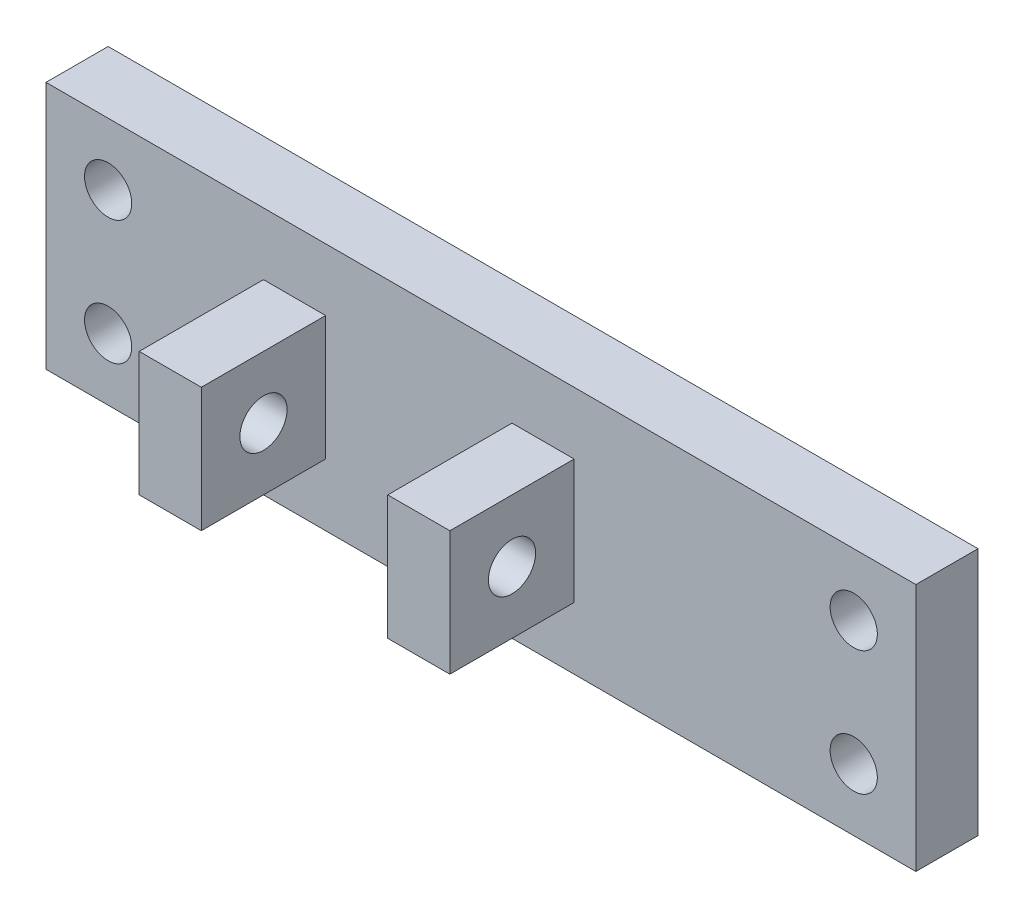
ISO-10303-21;
HEADER;
FILE_DESCRIPTION(('STEP AP214'),'2;1');
FILE_NAME('part.step','',(''),(''),'','','');
FILE_SCHEMA(('AUTOMOTIVE_DESIGN { 1 0 10303 214 1 1 1 1 }'));
ENDSEC;
DATA;
#1=APPLICATION_CONTEXT('core data for automotive mechanical design processes');
#2=APPLICATION_PROTOCOL_DEFINITION('international standard','automotive_design',2000,#1);
#3=PRODUCT_CONTEXT('',#1,'mechanical');
#4=PRODUCT('Part','Part','',(#3));
#5=PRODUCT_RELATED_PRODUCT_CATEGORY('part','',(#4));
#6=PRODUCT_DEFINITION_FORMATION('','',#4);
#7=PRODUCT_DEFINITION_CONTEXT('part definition',#1,'design');
#8=PRODUCT_DEFINITION('design','',#6,#7);
#9=PRODUCT_DEFINITION_SHAPE('','',#8);
#10=(LENGTH_UNIT() NAMED_UNIT(*) SI_UNIT(.MILLI.,.METRE.));
#11=(NAMED_UNIT(*) PLANE_ANGLE_UNIT() SI_UNIT($,.RADIAN.));
#12=(NAMED_UNIT(*) SI_UNIT($,.STERADIAN.) SOLID_ANGLE_UNIT());
#13=UNCERTAINTY_MEASURE_WITH_UNIT(LENGTH_MEASURE(1.E-05),#10,'distance_accuracy_value','');
#14=(GEOMETRIC_REPRESENTATION_CONTEXT(3) GLOBAL_UNCERTAINTY_ASSIGNED_CONTEXT((#13)) GLOBAL_UNIT_ASSIGNED_CONTEXT((#10,
#11,#12)) REPRESENTATION_CONTEXT('',''));
#15=CARTESIAN_POINT('',(0.,0.,0.));
#16=DIRECTION('',(0.,0.,1.));
#17=DIRECTION('',(1.,0.,0.));
#18=AXIS2_PLACEMENT_3D('',#15,#16,#17);
#19=CARTESIAN_POINT('',(7.5,-5.,15.));
#20=DIRECTION('',(0.,1.,0.));
#21=DIRECTION('',(-1.,0.,0.));
#22=AXIS2_PLACEMENT_3D('',#19,#20,#21);
#23=PLANE('',#22);
#24=DIRECTION('',(1.,0.,0.));
#25=VECTOR('',#24,1.);
#26=CARTESIAN_POINT('',(7.5,-5.,5.));
#27=LINE('',#26,#25);
#28=CARTESIAN_POINT('',(-17.5,-5.,5.));
#29=VERTEX_POINT('',#28);
#30=CARTESIAN_POINT('',(-12.5,-5.,5.));
#31=VERTEX_POINT('',#30);
#32=EDGE_CURVE('E147',#29,#31,#27,.T.);
#33=ORIENTED_EDGE('',*,*,#32,.T.);
#34=DIRECTION('',(0.,0.,1.));
#35=VECTOR('',#34,1.);
#36=CARTESIAN_POINT('',(-12.5,-5.,5.));
#37=LINE('',#36,#35);
#38=CARTESIAN_POINT('',(-12.5,-5.,15.));
#39=VERTEX_POINT('',#38);
#40=EDGE_CURVE('E130',#31,#39,#37,.T.);
#41=ORIENTED_EDGE('',*,*,#40,.T.);
#42=DIRECTION('',(1.,0.,0.));
#43=VECTOR('',#42,1.);
#44=CARTESIAN_POINT('',(7.5,-5.,15.));
#45=LINE('',#44,#43);
#46=CARTESIAN_POINT('',(-17.5,-5.,15.));
#47=VERTEX_POINT('',#46);
#48=EDGE_CURVE('E279',#47,#39,#45,.T.);
#49=ORIENTED_EDGE('',*,*,#48,.F.);
#50=DIRECTION('',(0.,0.,-1.));
#51=VECTOR('',#50,1.);
#52=CARTESIAN_POINT('',(-17.5,-5.,15.));
#53=LINE('',#52,#51);
#54=EDGE_CURVE('E152',#47,#29,#53,.T.);
#55=ORIENTED_EDGE('',*,*,#54,.T.);
#56=EDGE_LOOP('',(#33,#41,#49,#55));
#57=FACE_BOUND('',#56,.T.);
#58=ADVANCED_FACE('F39',(#57),#23,.F.);
#59=CARTESIAN_POINT('',(7.5,5.,15.));
#60=DIRECTION('',(0.,-1.,0.));
#61=DIRECTION('',(1.,0.,0.));
#62=AXIS2_PLACEMENT_3D('',#59,#60,#61);
#63=PLANE('',#62);
#64=DIRECTION('',(-1.,0.,0.));
#65=VECTOR('',#64,1.);
#66=CARTESIAN_POINT('',(7.5,5.,15.));
#67=LINE('',#66,#65);
#68=CARTESIAN_POINT('',(-12.5,5.,15.));
#69=VERTEX_POINT('',#68);
#70=CARTESIAN_POINT('',(-17.5,5.,15.));
#71=VERTEX_POINT('',#70);
#72=EDGE_CURVE('E285',#69,#71,#67,.T.);
#73=ORIENTED_EDGE('',*,*,#72,.F.);
#74=DIRECTION('',(0.,0.,1.));
#75=VECTOR('',#74,1.);
#76=CARTESIAN_POINT('',(-12.5,5.,5.));
#77=LINE('',#76,#75);
#78=CARTESIAN_POINT('',(-12.5,5.,5.));
#79=VERTEX_POINT('',#78);
#80=EDGE_CURVE('E292',#79,#69,#77,.T.);
#81=ORIENTED_EDGE('',*,*,#80,.F.);
#82=DIRECTION('',(-1.,0.,0.));
#83=VECTOR('',#82,1.);
#84=CARTESIAN_POINT('',(7.5,5.,5.));
#85=LINE('',#84,#83);
#86=CARTESIAN_POINT('',(-17.5,5.,5.));
#87=VERTEX_POINT('',#86);
#88=EDGE_CURVE('E148',#79,#87,#85,.T.);
#89=ORIENTED_EDGE('',*,*,#88,.T.);
#90=DIRECTION('',(0.,0.,-1.));
#91=VECTOR('',#90,1.);
#92=CARTESIAN_POINT('',(-17.5,5.,15.));
#93=LINE('',#92,#91);
#94=EDGE_CURVE('E165',#71,#87,#93,.T.);
#95=ORIENTED_EDGE('',*,*,#94,.F.);
#96=EDGE_LOOP('',(#73,#81,#89,#95));
#97=FACE_BOUND('',#96,.T.);
#98=ADVANCED_FACE('F250',(#97),#63,.F.);
#99=CARTESIAN_POINT('',(0.,0.,15.));
#100=DIRECTION('',(0.,0.,1.));
#101=DIRECTION('',(1.,0.,0.));
#102=AXIS2_PLACEMENT_3D('',#99,#100,#101);
#103=PLANE('',#102);
#104=DIRECTION('',(0.,-1.,0.));
#105=VECTOR('',#104,1.);
#106=CARTESIAN_POINT('',(-12.5,5.,15.));
#107=LINE('',#106,#105);
#108=EDGE_CURVE('E136',#69,#39,#107,.T.);
#109=ORIENTED_EDGE('',*,*,#108,.F.);
#110=ORIENTED_EDGE('',*,*,#72,.T.);
#111=DIRECTION('',(0.,-1.,0.));
#112=VECTOR('',#111,1.);
#113=CARTESIAN_POINT('',(-17.5,-5.,15.));
#114=LINE('',#113,#112);
#115=EDGE_CURVE('E164',#71,#47,#114,.T.);
#116=ORIENTED_EDGE('',*,*,#115,.T.);
#117=ORIENTED_EDGE('',*,*,#48,.T.);
#118=EDGE_LOOP('',(#109,#110,#116,#117));
#119=FACE_BOUND('',#118,.T.);
#120=ADVANCED_FACE('F256',(#119),#103,.T.);
#121=CARTESIAN_POINT('',(0.,0.,5.));
#122=DIRECTION('',(0.,0.,1.));
#123=DIRECTION('',(1.,0.,0.));
#124=AXIS2_PLACEMENT_3D('',#121,#122,#123);
#125=PLANE('',#124);
#126=CARTESIAN_POINT('',(2.50000000000001,-5.,5.));
#127=VERTEX_POINT('',#126);
#128=CARTESIAN_POINT('',(7.5,-5.,5.));
#129=VERTEX_POINT('',#128);
#130=EDGE_CURVE('E155',#127,#129,#27,.T.);
#131=ORIENTED_EDGE('',*,*,#130,.F.);
#132=DIRECTION('',(0.,1.,0.));
#133=VECTOR('',#132,1.);
#134=CARTESIAN_POINT('',(2.5,5.,5.));
#135=LINE('',#134,#133);
#136=CARTESIAN_POINT('',(2.5,5.,5.));
#137=VERTEX_POINT('',#136);
#138=EDGE_CURVE('E140',#127,#137,#135,.T.);
#139=ORIENTED_EDGE('',*,*,#138,.T.);
#140=CARTESIAN_POINT('',(7.5,5.,5.));
#141=VERTEX_POINT('',#140);
#142=EDGE_CURVE('E162',#141,#137,#85,.T.);
#143=ORIENTED_EDGE('',*,*,#142,.F.);
#144=DIRECTION('',(0.,1.,0.));
#145=VECTOR('',#144,1.);
#146=CARTESIAN_POINT('',(7.5,-5.,5.));
#147=LINE('',#146,#145);
#148=EDGE_CURVE('E154',#129,#141,#147,.T.);
#149=ORIENTED_EDGE('',*,*,#148,.F.);
#150=EDGE_LOOP('',(#131,#139,#143,#149));
#151=FACE_BOUND('',#150,.T.);
#152=CARTESIAN_POINT('',(-30.,-5.,5.));
#153=DIRECTION('',(0.,0.,1.));
#154=DIRECTION('',(1.,0.,0.));
#155=AXIS2_PLACEMENT_3D('',#152,#153,#154);
#156=CIRCLE('',#155,1.9);
#157=CARTESIAN_POINT('',(-28.1,-5.,5.));
#158=VERTEX_POINT('',#157);
#159=EDGE_CURVE('E181',#158,#158,#156,.T.);
#160=ORIENTED_EDGE('',*,*,#159,.F.);
#161=EDGE_LOOP('',(#160));
#162=FACE_BOUND('',#161,.T.);
#163=CARTESIAN_POINT('',(30.,5.,5.));
#164=DIRECTION('',(0.,0.,1.));
#165=DIRECTION('',(1.,0.,0.));
#166=AXIS2_PLACEMENT_3D('',#163,#164,#165);
#167=CIRCLE('',#166,1.9);
#168=CARTESIAN_POINT('',(31.9,5.,5.));
#169=VERTEX_POINT('',#168);
#170=EDGE_CURVE('E188',#169,#169,#167,.T.);
#171=ORIENTED_EDGE('',*,*,#170,.F.);
#172=EDGE_LOOP('',(#171));
#173=FACE_BOUND('',#172,.T.);
#174=CARTESIAN_POINT('',(30.,-5.,5.));
#175=DIRECTION('',(0.,0.,1.));
#176=DIRECTION('',(1.,0.,0.));
#177=AXIS2_PLACEMENT_3D('',#174,#175,#176);
#178=CIRCLE('',#177,1.9);
#179=CARTESIAN_POINT('',(31.9,-5.,5.));
#180=VERTEX_POINT('',#179);
#181=EDGE_CURVE('E175',#180,#180,#178,.T.);
#182=ORIENTED_EDGE('',*,*,#181,.F.);
#183=EDGE_LOOP('',(#182));
#184=FACE_BOUND('',#183,.T.);
#185=CARTESIAN_POINT('',(-30.,5.,5.));
#186=DIRECTION('',(0.,0.,1.));
#187=DIRECTION('',(1.,0.,0.));
#188=AXIS2_PLACEMENT_3D('',#185,#186,#187);
#189=CIRCLE('',#188,1.9);
#190=CARTESIAN_POINT('',(-28.1,5.,5.));
#191=VERTEX_POINT('',#190);
#192=EDGE_CURVE('E184',#191,#191,#189,.T.);
#193=ORIENTED_EDGE('',*,*,#192,.F.);
#194=EDGE_LOOP('',(#193));
#195=FACE_BOUND('',#194,.T.);
#196=DIRECTION('',(0.,-1.,0.));
#197=VECTOR('',#196,1.);
#198=CARTESIAN_POINT('',(-35.,-10.,5.));
#199=LINE('',#198,#197);
#200=CARTESIAN_POINT('',(-35.,10.,5.));
#201=VERTEX_POINT('',#200);
#202=CARTESIAN_POINT('',(-35.,-10.,5.));
#203=VERTEX_POINT('',#202);
#204=EDGE_CURVE('E199',#201,#203,#199,.T.);
#205=ORIENTED_EDGE('',*,*,#204,.T.);
#206=DIRECTION('',(1.,0.,0.));
#207=VECTOR('',#206,1.);
#208=CARTESIAN_POINT('',(35.,-9.99999999999999,5.));
#209=LINE('',#208,#207);
#210=CARTESIAN_POINT('',(35.,-9.99999999999999,5.));
#211=VERTEX_POINT('',#210);
#212=EDGE_CURVE('E202',#203,#211,#209,.T.);
#213=ORIENTED_EDGE('',*,*,#212,.T.);
#214=DIRECTION('',(0.,1.,0.));
#215=VECTOR('',#214,1.);
#216=CARTESIAN_POINT('',(35.,-9.99999999999999,5.));
#217=LINE('',#216,#215);
#218=CARTESIAN_POINT('',(35.,10.,5.));
#219=VERTEX_POINT('',#218);
#220=EDGE_CURVE('E205',#211,#219,#217,.T.);
#221=ORIENTED_EDGE('',*,*,#220,.T.);
#222=DIRECTION('',(-1.,0.,0.));
#223=VECTOR('',#222,1.);
#224=CARTESIAN_POINT('',(35.,10.,5.));
#225=LINE('',#224,#223);
#226=EDGE_CURVE('E207',#219,#201,#225,.T.);
#227=ORIENTED_EDGE('',*,*,#226,.T.);
#228=EDGE_LOOP('',(#205,#213,#221,#227));
#229=FACE_BOUND('',#228,.T.);
#230=ORIENTED_EDGE('',*,*,#32,.F.);
#231=DIRECTION('',(0.,-1.,0.));
#232=VECTOR('',#231,1.);
#233=CARTESIAN_POINT('',(-17.5,-5.,5.));
#234=LINE('',#233,#232);
#235=EDGE_CURVE('E158',#87,#29,#234,.T.);
#236=ORIENTED_EDGE('',*,*,#235,.F.);
#237=ORIENTED_EDGE('',*,*,#88,.F.);
#238=DIRECTION('',(0.,-1.,0.));
#239=VECTOR('',#238,1.);
#240=CARTESIAN_POINT('',(-12.5,5.,5.));
#241=LINE('',#240,#239);
#242=EDGE_CURVE('E133',#79,#31,#241,.T.);
#243=ORIENTED_EDGE('',*,*,#242,.T.);
#244=EDGE_LOOP('',(#230,#236,#237,#243));
#245=FACE_BOUND('',#244,.T.);
#246=ADVANCED_FACE('F145',(#151,#162,#173,#184,#195,#229,#245),#125,.T.);
#247=CARTESIAN_POINT('',(-35.,-10.,5.));
#248=DIRECTION('',(1.,0.,0.));
#249=DIRECTION('',(0.,0.,-1.));
#250=AXIS2_PLACEMENT_3D('',#247,#248,#249);
#251=PLANE('',#250);
#252=DIRECTION('',(0.,-1.,0.));
#253=VECTOR('',#252,1.);
#254=CARTESIAN_POINT('',(-35.,-10.,0.));
#255=LINE('',#254,#253);
#256=CARTESIAN_POINT('',(-35.,10.,0.));
#257=VERTEX_POINT('',#256);
#258=CARTESIAN_POINT('',(-35.,-10.,0.));
#259=VERTEX_POINT('',#258);
#260=EDGE_CURVE('E196',#257,#259,#255,.T.);
#261=ORIENTED_EDGE('',*,*,#260,.T.);
#262=DIRECTION('',(0.,0.,-1.));
#263=VECTOR('',#262,1.);
#264=CARTESIAN_POINT('',(-35.,-10.,5.));
#265=LINE('',#264,#263);
#266=EDGE_CURVE('E11',#203,#259,#265,.T.);
#267=ORIENTED_EDGE('',*,*,#266,.F.);
#268=ORIENTED_EDGE('',*,*,#204,.F.);
#269=DIRECTION('',(0.,0.,-1.));
#270=VECTOR('',#269,1.);
#271=CARTESIAN_POINT('',(-35.,10.,5.));
#272=LINE('',#271,#270);
#273=EDGE_CURVE('E209',#201,#257,#272,.T.);
#274=ORIENTED_EDGE('',*,*,#273,.T.);
#275=EDGE_LOOP('',(#261,#267,#268,#274));
#276=FACE_BOUND('',#275,.T.);
#277=ADVANCED_FACE('F41',(#276),#251,.F.);
#278=CARTESIAN_POINT('',(35.,-9.99999999999999,5.));
#279=DIRECTION('',(0.,1.,0.));
#280=DIRECTION('',(-1.,0.,0.));
#281=AXIS2_PLACEMENT_3D('',#278,#279,#280);
#282=PLANE('',#281);
#283=DIRECTION('',(1.,0.,0.));
#284=VECTOR('',#283,1.);
#285=CARTESIAN_POINT('',(35.,-9.99999999999999,0.));
#286=LINE('',#285,#284);
#287=CARTESIAN_POINT('',(35.,-9.99999999999999,0.));
#288=VERTEX_POINT('',#287);
#289=EDGE_CURVE('E212',#259,#288,#286,.T.);
#290=ORIENTED_EDGE('',*,*,#289,.T.);
#291=DIRECTION('',(0.,0.,-1.));
#292=VECTOR('',#291,1.);
#293=CARTESIAN_POINT('',(35.,-9.99999999999999,5.));
#294=LINE('',#293,#292);
#295=EDGE_CURVE('E48',#211,#288,#294,.T.);
#296=ORIENTED_EDGE('',*,*,#295,.F.);
#297=ORIENTED_EDGE('',*,*,#212,.F.);
#298=ORIENTED_EDGE('',*,*,#266,.T.);
#299=EDGE_LOOP('',(#290,#296,#297,#298));
#300=FACE_BOUND('',#299,.T.);
#301=ADVANCED_FACE('F242',(#300),#282,.F.);
#302=CARTESIAN_POINT('',(35.,-9.99999999999999,5.));
#303=DIRECTION('',(-1.,0.,0.));
#304=DIRECTION('',(0.,0.,1.));
#305=AXIS2_PLACEMENT_3D('',#302,#303,#304);
#306=PLANE('',#305);
#307=DIRECTION('',(0.,1.,0.));
#308=VECTOR('',#307,1.);
#309=CARTESIAN_POINT('',(35.,-9.99999999999999,0.));
#310=LINE('',#309,#308);
#311=CARTESIAN_POINT('',(35.,10.,0.));
#312=VERTEX_POINT('',#311);
#313=EDGE_CURVE('E214',#288,#312,#310,.T.);
#314=ORIENTED_EDGE('',*,*,#313,.T.);
#315=DIRECTION('',(0.,0.,-1.));
#316=VECTOR('',#315,1.);
#317=CARTESIAN_POINT('',(35.,10.,5.));
#318=LINE('',#317,#316);
#319=EDGE_CURVE('E219',#219,#312,#318,.T.);
#320=ORIENTED_EDGE('',*,*,#319,.F.);
#321=ORIENTED_EDGE('',*,*,#220,.F.);
#322=ORIENTED_EDGE('',*,*,#295,.T.);
#323=EDGE_LOOP('',(#314,#320,#321,#322));
#324=FACE_BOUND('',#323,.T.);
#325=ADVANCED_FACE('F227',(#324),#306,.F.);
#326=CARTESIAN_POINT('',(35.,10.,5.));
#327=DIRECTION('',(0.,-1.,0.));
#328=DIRECTION('',(1.,0.,0.));
#329=AXIS2_PLACEMENT_3D('',#326,#327,#328);
#330=PLANE('',#329);
#331=DIRECTION('',(-1.,0.,0.));
#332=VECTOR('',#331,1.);
#333=CARTESIAN_POINT('',(35.,10.,0.));
#334=LINE('',#333,#332);
#335=EDGE_CURVE('E203',#312,#257,#334,.T.);
#336=ORIENTED_EDGE('',*,*,#335,.T.);
#337=ORIENTED_EDGE('',*,*,#273,.F.);
#338=ORIENTED_EDGE('',*,*,#226,.F.);
#339=ORIENTED_EDGE('',*,*,#319,.T.);
#340=EDGE_LOOP('',(#336,#337,#338,#339));
#341=FACE_BOUND('',#340,.T.);
#342=ADVANCED_FACE('F236',(#341),#330,.F.);
#343=CARTESIAN_POINT('',(0.,0.,0.));
#344=DIRECTION('',(0.,0.,1.));
#345=DIRECTION('',(1.,0.,0.));
#346=AXIS2_PLACEMENT_3D('',#343,#344,#345);
#347=PLANE('',#346);
#348=CARTESIAN_POINT('',(-30.,-5.,0.));
#349=DIRECTION('',(0.,0.,1.));
#350=DIRECTION('',(1.,0.,0.));
#351=AXIS2_PLACEMENT_3D('',#348,#349,#350);
#352=CIRCLE('',#351,1.9);
#353=CARTESIAN_POINT('',(-28.1,-5.,0.));
#354=VERTEX_POINT('',#353);
#355=EDGE_CURVE('E185',#354,#354,#352,.T.);
#356=ORIENTED_EDGE('',*,*,#355,.T.);
#357=EDGE_LOOP('',(#356));
#358=FACE_BOUND('',#357,.T.);
#359=CARTESIAN_POINT('',(30.,5.,0.));
#360=DIRECTION('',(0.,0.,1.));
#361=DIRECTION('',(1.,0.,0.));
#362=AXIS2_PLACEMENT_3D('',#359,#360,#361);
#363=CIRCLE('',#362,1.9);
#364=CARTESIAN_POINT('',(31.9,5.,0.));
#365=VERTEX_POINT('',#364);
#366=EDGE_CURVE('E178',#365,#365,#363,.T.);
#367=ORIENTED_EDGE('',*,*,#366,.T.);
#368=EDGE_LOOP('',(#367));
#369=FACE_BOUND('',#368,.T.);
#370=CARTESIAN_POINT('',(30.,-5.,0.));
#371=DIRECTION('',(0.,0.,1.));
#372=DIRECTION('',(1.,0.,0.));
#373=AXIS2_PLACEMENT_3D('',#370,#371,#372);
#374=CIRCLE('',#373,1.9);
#375=CARTESIAN_POINT('',(31.9,-5.,0.));
#376=VERTEX_POINT('',#375);
#377=EDGE_CURVE('E174',#376,#376,#374,.T.);
#378=ORIENTED_EDGE('',*,*,#377,.T.);
#379=EDGE_LOOP('',(#378));
#380=FACE_BOUND('',#379,.T.);
#381=CARTESIAN_POINT('',(-30.,5.,0.));
#382=DIRECTION('',(0.,0.,1.));
#383=DIRECTION('',(1.,0.,0.));
#384=AXIS2_PLACEMENT_3D('',#381,#382,#383);
#385=CIRCLE('',#384,1.9);
#386=CARTESIAN_POINT('',(-28.1,5.,0.));
#387=VERTEX_POINT('',#386);
#388=EDGE_CURVE('E193',#387,#387,#385,.T.);
#389=ORIENTED_EDGE('',*,*,#388,.T.);
#390=EDGE_LOOP('',(#389));
#391=FACE_BOUND('',#390,.T.);
#392=ORIENTED_EDGE('',*,*,#260,.F.);
#393=ORIENTED_EDGE('',*,*,#335,.F.);
#394=ORIENTED_EDGE('',*,*,#313,.F.);
#395=ORIENTED_EDGE('',*,*,#289,.F.);
#396=EDGE_LOOP('',(#392,#393,#394,#395));
#397=FACE_BOUND('',#396,.T.);
#398=ADVANCED_FACE('F233',(#358,#369,#380,#391,#397),#347,.F.);
#399=CARTESIAN_POINT('',(-30.,5.,0.));
#400=DIRECTION('',(0.,0.,1.));
#401=DIRECTION('',(1.,0.,0.));
#402=AXIS2_PLACEMENT_3D('',#399,#400,#401);
#403=CYLINDRICAL_SURFACE('',#402,1.9);
#404=ORIENTED_EDGE('',*,*,#388,.F.);
#405=EDGE_LOOP('',(#404));
#406=FACE_BOUND('',#405,.T.);
#407=ORIENTED_EDGE('',*,*,#192,.T.);
#408=EDGE_LOOP('',(#407));
#409=FACE_BOUND('',#408,.T.);
#410=ADVANCED_FACE('F347',(#406,#409),#403,.F.);
#411=CARTESIAN_POINT('',(30.,-5.,0.));
#412=DIRECTION('',(0.,0.,1.));
#413=DIRECTION('',(1.,0.,0.));
#414=AXIS2_PLACEMENT_3D('',#411,#412,#413);
#415=CYLINDRICAL_SURFACE('',#414,1.9);
#416=ORIENTED_EDGE('',*,*,#377,.F.);
#417=EDGE_LOOP('',(#416));
#418=FACE_BOUND('',#417,.T.);
#419=ORIENTED_EDGE('',*,*,#181,.T.);
#420=EDGE_LOOP('',(#419));
#421=FACE_BOUND('',#420,.T.);
#422=ADVANCED_FACE('F367',(#418,#421),#415,.F.);
#423=CARTESIAN_POINT('',(30.,5.,0.));
#424=DIRECTION('',(0.,0.,1.));
#425=DIRECTION('',(1.,0.,0.));
#426=AXIS2_PLACEMENT_3D('',#423,#424,#425);
#427=CYLINDRICAL_SURFACE('',#426,1.9);
#428=ORIENTED_EDGE('',*,*,#366,.F.);
#429=EDGE_LOOP('',(#428));
#430=FACE_BOUND('',#429,.T.);
#431=ORIENTED_EDGE('',*,*,#170,.T.);
#432=EDGE_LOOP('',(#431));
#433=FACE_BOUND('',#432,.T.);
#434=ADVANCED_FACE('F374',(#430,#433),#427,.F.);
#435=CARTESIAN_POINT('',(-30.,-5.,0.));
#436=DIRECTION('',(0.,0.,1.));
#437=DIRECTION('',(1.,0.,0.));
#438=AXIS2_PLACEMENT_3D('',#435,#436,#437);
#439=CYLINDRICAL_SURFACE('',#438,1.9);
#440=ORIENTED_EDGE('',*,*,#355,.F.);
#441=EDGE_LOOP('',(#440));
#442=FACE_BOUND('',#441,.T.);
#443=ORIENTED_EDGE('',*,*,#159,.T.);
#444=EDGE_LOOP('',(#443));
#445=FACE_BOUND('',#444,.T.);
#446=ADVANCED_FACE('F271',(#442,#445),#439,.F.);
#447=CARTESIAN_POINT('',(-17.5,-5.,15.));
#448=DIRECTION('',(1.,0.,0.));
#449=DIRECTION('',(0.,0.,-1.));
#450=AXIS2_PLACEMENT_3D('',#447,#448,#449);
#451=PLANE('',#450);
#452=CARTESIAN_POINT('',(-17.5,0.,10.));
#453=DIRECTION('',(-1.,0.,0.));
#454=DIRECTION('',(0.,0.,1.));
#455=AXIS2_PLACEMENT_3D('',#452,#453,#454);
#456=CIRCLE('',#455,1.9);
#457=CARTESIAN_POINT('',(-17.5,0.,11.9));
#458=VERTEX_POINT('',#457);
#459=EDGE_CURVE('E309',#458,#458,#456,.T.);
#460=ORIENTED_EDGE('',*,*,#459,.F.);
#461=EDGE_LOOP('',(#460));
#462=FACE_BOUND('',#461,.T.);
#463=ORIENTED_EDGE('',*,*,#235,.T.);
#464=ORIENTED_EDGE('',*,*,#54,.F.);
#465=ORIENTED_EDGE('',*,*,#115,.F.);
#466=ORIENTED_EDGE('',*,*,#94,.T.);
#467=EDGE_LOOP('',(#463,#464,#465,#466));
#468=FACE_BOUND('',#467,.T.);
#469=ADVANCED_FACE('F264',(#462,#468),#451,.F.);
#470=CARTESIAN_POINT('',(2.50000000000001,-5.,15.));
#471=VERTEX_POINT('',#470);
#472=CARTESIAN_POINT('',(7.5,-5.,15.));
#473=VERTEX_POINT('',#472);
#474=EDGE_CURVE('E275',#471,#473,#45,.T.);
#475=ORIENTED_EDGE('',*,*,#474,.F.);
#476=DIRECTION('',(0.,0.,1.));
#477=VECTOR('',#476,1.);
#478=CARTESIAN_POINT('',(2.50000000000001,-5.,5.));
#479=LINE('',#478,#477);
#480=EDGE_CURVE('E55',#127,#471,#479,.T.);
#481=ORIENTED_EDGE('',*,*,#480,.F.);
#482=ORIENTED_EDGE('',*,*,#130,.T.);
#483=DIRECTION('',(0.,0.,-1.));
#484=VECTOR('',#483,1.);
#485=CARTESIAN_POINT('',(7.5,-5.,15.));
#486=LINE('',#485,#484);
#487=EDGE_CURVE('E170',#473,#129,#486,.T.);
#488=ORIENTED_EDGE('',*,*,#487,.F.);
#489=EDGE_LOOP('',(#475,#481,#482,#488));
#490=FACE_BOUND('',#489,.T.);
#491=ADVANCED_FACE('F252',(#490),#23,.F.);
#492=CARTESIAN_POINT('',(7.5,-5.,15.));
#493=DIRECTION('',(-1.,0.,0.));
#494=DIRECTION('',(0.,0.,1.));
#495=AXIS2_PLACEMENT_3D('',#492,#493,#494);
#496=PLANE('',#495);
#497=CARTESIAN_POINT('',(7.5,0.,10.));
#498=DIRECTION('',(-1.,0.,0.));
#499=DIRECTION('',(0.,0.,1.));
#500=AXIS2_PLACEMENT_3D('',#497,#498,#499);
#501=CIRCLE('',#500,1.9);
#502=CARTESIAN_POINT('',(7.5,0.,11.9));
#503=VERTEX_POINT('',#502);
#504=EDGE_CURVE('E301',#503,#503,#501,.T.);
#505=ORIENTED_EDGE('',*,*,#504,.T.);
#506=EDGE_LOOP('',(#505));
#507=FACE_BOUND('',#506,.T.);
#508=ORIENTED_EDGE('',*,*,#148,.T.);
#509=DIRECTION('',(0.,0.,-1.));
#510=VECTOR('',#509,1.);
#511=CARTESIAN_POINT('',(7.5,5.,15.));
#512=LINE('',#511,#510);
#513=CARTESIAN_POINT('',(7.5,5.,15.));
#514=VERTEX_POINT('',#513);
#515=EDGE_CURVE('E63',#514,#141,#512,.T.);
#516=ORIENTED_EDGE('',*,*,#515,.F.);
#517=DIRECTION('',(0.,1.,0.));
#518=VECTOR('',#517,1.);
#519=CARTESIAN_POINT('',(7.5,-5.,15.));
#520=LINE('',#519,#518);
#521=EDGE_CURVE('E281',#473,#514,#520,.T.);
#522=ORIENTED_EDGE('',*,*,#521,.F.);
#523=ORIENTED_EDGE('',*,*,#487,.T.);
#524=EDGE_LOOP('',(#508,#516,#522,#523));
#525=FACE_BOUND('',#524,.T.);
#526=ADVANCED_FACE('F263',(#507,#525),#496,.F.);
#527=ORIENTED_EDGE('',*,*,#142,.T.);
#528=DIRECTION('',(0.,0.,1.));
#529=VECTOR('',#528,1.);
#530=CARTESIAN_POINT('',(2.5,5.,5.));
#531=LINE('',#530,#529);
#532=CARTESIAN_POINT('',(2.5,5.,15.));
#533=VERTEX_POINT('',#532);
#534=EDGE_CURVE('E293',#137,#533,#531,.T.);
#535=ORIENTED_EDGE('',*,*,#534,.T.);
#536=EDGE_CURVE('E168',#514,#533,#67,.T.);
#537=ORIENTED_EDGE('',*,*,#536,.F.);
#538=ORIENTED_EDGE('',*,*,#515,.T.);
#539=EDGE_LOOP('',(#527,#535,#537,#538));
#540=FACE_BOUND('',#539,.T.);
#541=ADVANCED_FACE('F259',(#540),#63,.F.);
#542=DIRECTION('',(0.,1.,0.));
#543=VECTOR('',#542,1.);
#544=CARTESIAN_POINT('',(2.5,5.,15.));
#545=LINE('',#544,#543);
#546=EDGE_CURVE('E149',#471,#533,#545,.T.);
#547=ORIENTED_EDGE('',*,*,#546,.F.);
#548=ORIENTED_EDGE('',*,*,#474,.T.);
#549=ORIENTED_EDGE('',*,*,#521,.T.);
#550=ORIENTED_EDGE('',*,*,#536,.T.);
#551=EDGE_LOOP('',(#547,#548,#549,#550));
#552=FACE_BOUND('',#551,.T.);
#553=ADVANCED_FACE('F329',(#552),#103,.T.);
#554=CARTESIAN_POINT('',(-12.5,5.,5.));
#555=DIRECTION('',(-1.,0.,0.));
#556=DIRECTION('',(0.,-1.,0.));
#557=AXIS2_PLACEMENT_3D('',#554,#555,#556);
#558=PLANE('',#557);
#559=CARTESIAN_POINT('',(-12.5,0.,10.));
#560=DIRECTION('',(-1.,0.,0.));
#561=DIRECTION('',(0.,-1.,0.));
#562=AXIS2_PLACEMENT_3D('',#559,#560,#561);
#563=CIRCLE('',#562,1.9);
#564=CARTESIAN_POINT('',(-12.5,-1.9,10.));
#565=VERTEX_POINT('',#564);
#566=EDGE_CURVE('E306',#565,#565,#563,.T.);
#567=ORIENTED_EDGE('',*,*,#566,.T.);
#568=EDGE_LOOP('',(#567));
#569=FACE_BOUND('',#568,.T.);
#570=ORIENTED_EDGE('',*,*,#108,.T.);
#571=ORIENTED_EDGE('',*,*,#40,.F.);
#572=ORIENTED_EDGE('',*,*,#242,.F.);
#573=ORIENTED_EDGE('',*,*,#80,.T.);
#574=EDGE_LOOP('',(#570,#571,#572,#573));
#575=FACE_BOUND('',#574,.T.);
#576=ADVANCED_FACE('F132',(#569,#575),#558,.F.);
#577=CARTESIAN_POINT('',(2.5,5.,5.));
#578=DIRECTION('',(1.,0.,0.));
#579=DIRECTION('',(0.,1.,0.));
#580=AXIS2_PLACEMENT_3D('',#577,#578,#579);
#581=PLANE('',#580);
#582=CARTESIAN_POINT('',(2.5,0.,10.));
#583=DIRECTION('',(1.,0.,0.));
#584=DIRECTION('',(0.,1.,0.));
#585=AXIS2_PLACEMENT_3D('',#582,#583,#584);
#586=CIRCLE('',#585,1.9);
#587=CARTESIAN_POINT('',(2.5,1.9,10.));
#588=VERTEX_POINT('',#587);
#589=EDGE_CURVE('E43',#588,#588,#586,.T.);
#590=ORIENTED_EDGE('',*,*,#589,.T.);
#591=EDGE_LOOP('',(#590));
#592=FACE_BOUND('',#591,.T.);
#593=ORIENTED_EDGE('',*,*,#546,.T.);
#594=ORIENTED_EDGE('',*,*,#534,.F.);
#595=ORIENTED_EDGE('',*,*,#138,.F.);
#596=ORIENTED_EDGE('',*,*,#480,.T.);
#597=EDGE_LOOP('',(#593,#594,#595,#596));
#598=FACE_BOUND('',#597,.T.);
#599=ADVANCED_FACE('F316',(#592,#598),#581,.F.);
#600=CARTESIAN_POINT('',(35.,0.,10.));
#601=DIRECTION('',(-1.,0.,0.));
#602=DIRECTION('',(0.,0.,1.));
#603=AXIS2_PLACEMENT_3D('',#600,#601,#602);
#604=CYLINDRICAL_SURFACE('',#603,1.9);
#605=ORIENTED_EDGE('',*,*,#589,.F.);
#606=EDGE_LOOP('',(#605));
#607=FACE_BOUND('',#606,.T.);
#608=ORIENTED_EDGE('',*,*,#504,.F.);
#609=EDGE_LOOP('',(#608));
#610=FACE_BOUND('',#609,.T.);
#611=ADVANCED_FACE('F318',(#607,#610),#604,.F.);
#612=ORIENTED_EDGE('',*,*,#459,.T.);
#613=EDGE_LOOP('',(#612));
#614=FACE_BOUND('',#613,.T.);
#615=ORIENTED_EDGE('',*,*,#566,.F.);
#616=EDGE_LOOP('',(#615));
#617=FACE_BOUND('',#616,.T.);
#618=ADVANCED_FACE('F321',(#614,#617),#604,.F.);
#619=CLOSED_SHELL('',(#58,#98,#120,#246,#277,#301,#325,#342,#398,#410,#422,#434,#446,#469,#491,
#526,#541,#553,#576,#599,#611,#618));
#620=MANIFOLD_SOLID_BREP('B2',#619);
#621=ADVANCED_BREP_SHAPE_REPRESENTATION('',(#18,#620),#14);
#622=SHAPE_DEFINITION_REPRESENTATION(#9,#621);
ENDSEC;
END-ISO-10303-21;
